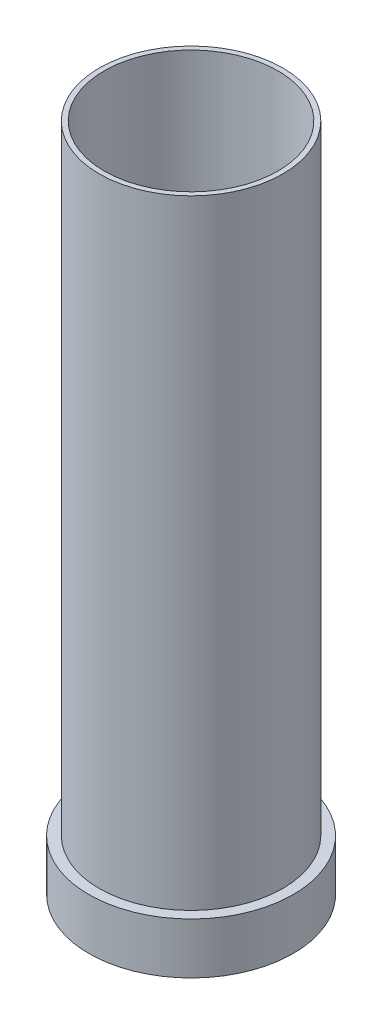
ISO-10303-21;
HEADER;
FILE_DESCRIPTION(('STEP AP214'),'2;1');
FILE_NAME('part.step','',(''),(''),'','','');
FILE_SCHEMA(('AUTOMOTIVE_DESIGN { 1 0 10303 214 1 1 1 1 }'));
ENDSEC;
DATA;
#1=APPLICATION_CONTEXT('core data for automotive mechanical design processes');
#2=APPLICATION_PROTOCOL_DEFINITION('international standard','automotive_design',2000,#1);
#3=PRODUCT_CONTEXT('',#1,'mechanical');
#4=PRODUCT('Part','Part','',(#3));
#5=PRODUCT_RELATED_PRODUCT_CATEGORY('part','',(#4));
#6=PRODUCT_DEFINITION_FORMATION('','',#4);
#7=PRODUCT_DEFINITION_CONTEXT('part definition',#1,'design');
#8=PRODUCT_DEFINITION('design','',#6,#7);
#9=PRODUCT_DEFINITION_SHAPE('','',#8);
#10=(LENGTH_UNIT() NAMED_UNIT(*) SI_UNIT(.MILLI.,.METRE.));
#11=(NAMED_UNIT(*) PLANE_ANGLE_UNIT() SI_UNIT($,.RADIAN.));
#12=(NAMED_UNIT(*) SI_UNIT($,.STERADIAN.) SOLID_ANGLE_UNIT());
#13=UNCERTAINTY_MEASURE_WITH_UNIT(LENGTH_MEASURE(1.E-05),#10,'distance_accuracy_value','');
#14=(GEOMETRIC_REPRESENTATION_CONTEXT(3) GLOBAL_UNCERTAINTY_ASSIGNED_CONTEXT((#13)) GLOBAL_UNIT_ASSIGNED_CONTEXT((#10,
#11,#12)) REPRESENTATION_CONTEXT('',''));
#15=CARTESIAN_POINT('',(0.,0.,0.));
#16=DIRECTION('',(0.,0.,1.));
#17=DIRECTION('',(1.,0.,0.));
#18=AXIS2_PLACEMENT_3D('',#15,#16,#17);
#19=CARTESIAN_POINT('',(0.,-77.2,0.));
#20=DIRECTION('',(0.,1.,0.));
#21=DIRECTION('',(0.,0.,1.));
#22=AXIS2_PLACEMENT_3D('',#19,#20,#21);
#23=CYLINDRICAL_SURFACE('',#22,22.45);
#24=CARTESIAN_POINT('',(0.,-77.2,0.));
#25=DIRECTION('',(0.,-1.,0.));
#26=DIRECTION('',(0.,0.,-1.));
#27=AXIS2_PLACEMENT_3D('',#24,#25,#26);
#28=CIRCLE('',#27,22.45);
#29=CARTESIAN_POINT('',(0.,-77.2,-22.45));
#30=VERTEX_POINT('',#29);
#31=EDGE_CURVE('E10',#30,#30,#28,.T.);
#32=ORIENTED_EDGE('',*,*,#31,.F.);
#33=EDGE_LOOP('',(#32));
#34=FACE_BOUND('',#33,.T.);
#35=CARTESIAN_POINT('',(0.,74.2,0.));
#36=DIRECTION('',(0.,1.,0.));
#37=DIRECTION('',(0.,0.,1.));
#38=AXIS2_PLACEMENT_3D('',#35,#36,#37);
#39=CIRCLE('',#38,22.45);
#40=CARTESIAN_POINT('',(0.,74.2,22.45));
#41=VERTEX_POINT('',#40);
#42=EDGE_CURVE('E40',#41,#41,#39,.F.);
#43=ORIENTED_EDGE('',*,*,#42,.T.);
#44=EDGE_LOOP('',(#43));
#45=FACE_BOUND('',#44,.T.);
#46=ADVANCED_FACE('F30',(#34,#45),#23,.T.);
#47=CARTESIAN_POINT('',(0.,-77.2,0.));
#48=DIRECTION('',(0.,1.,0.));
#49=DIRECTION('',(0.,0.,1.));
#50=AXIS2_PLACEMENT_3D('',#47,#48,#49);
#51=CYLINDRICAL_SURFACE('',#50,21.25);
#52=CARTESIAN_POINT('',(0.,-77.2,0.));
#53=DIRECTION('',(0.,-1.,0.));
#54=DIRECTION('',(0.,0.,-1.));
#55=AXIS2_PLACEMENT_3D('',#52,#53,#54);
#56=CIRCLE('',#55,21.25);
#57=CARTESIAN_POINT('',(0.,-77.2,-21.25));
#58=VERTEX_POINT('',#57);
#59=EDGE_CURVE('E45',#58,#58,#56,.T.);
#60=ORIENTED_EDGE('',*,*,#59,.T.);
#61=EDGE_LOOP('',(#60));
#62=FACE_BOUND('',#61,.T.);
#63=CARTESIAN_POINT('',(0.,74.2,0.));
#64=DIRECTION('',(0.,1.,0.));
#65=DIRECTION('',(0.,0.,1.));
#66=AXIS2_PLACEMENT_3D('',#63,#64,#65);
#67=CIRCLE('',#66,21.25);
#68=CARTESIAN_POINT('',(0.,74.2,21.25));
#69=VERTEX_POINT('',#68);
#70=EDGE_CURVE('E36',#69,#69,#67,.F.);
#71=ORIENTED_EDGE('',*,*,#70,.F.);
#72=EDGE_LOOP('',(#71));
#73=FACE_BOUND('',#72,.T.);
#74=ADVANCED_FACE('F76',(#62,#73),#51,.F.);
#75=CARTESIAN_POINT('',(0.,74.2,0.));
#76=DIRECTION('',(0.,1.,0.));
#77=DIRECTION('',(0.,0.,1.));
#78=AXIS2_PLACEMENT_3D('',#75,#76,#77);
#79=PLANE('',#78);
#80=ORIENTED_EDGE('',*,*,#42,.F.);
#81=EDGE_LOOP('',(#80));
#82=FACE_BOUND('',#81,.T.);
#83=ORIENTED_EDGE('',*,*,#70,.T.);
#84=EDGE_LOOP('',(#83));
#85=FACE_BOUND('',#84,.T.);
#86=ADVANCED_FACE('F73',(#82,#85),#79,.T.);
#87=CARTESIAN_POINT('',(0.,-77.2,0.));
#88=DIRECTION('',(0.,-1.,0.));
#89=DIRECTION('',(0.,0.,-1.));
#90=AXIS2_PLACEMENT_3D('',#87,#88,#89);
#91=PLANE('',#90);
#92=ORIENTED_EDGE('',*,*,#59,.F.);
#93=EDGE_LOOP('',(#92));
#94=FACE_BOUND('',#93,.T.);
#95=ADVANCED_FACE('F66',(#94),#91,.F.);
#96=CARTESIAN_POINT('',(0.,-89.7,0.));
#97=DIRECTION('',(0.,1.,0.));
#98=DIRECTION('',(0.,0.,1.));
#99=AXIS2_PLACEMENT_3D('',#96,#97,#98);
#100=CYLINDRICAL_SURFACE('',#99,25.);
#101=CARTESIAN_POINT('',(0.,-89.7,0.));
#102=DIRECTION('',(0.,-1.,0.));
#103=DIRECTION('',(0.,0.,-1.));
#104=AXIS2_PLACEMENT_3D('',#101,#102,#103);
#105=CIRCLE('',#104,25.);
#106=CARTESIAN_POINT('',(0.,-89.7,-25.));
#107=VERTEX_POINT('',#106);
#108=EDGE_CURVE('E51',#107,#107,#105,.T.);
#109=ORIENTED_EDGE('',*,*,#108,.F.);
#110=EDGE_LOOP('',(#109));
#111=FACE_BOUND('',#110,.T.);
#112=CARTESIAN_POINT('',(0.,-77.2,0.));
#113=DIRECTION('',(0.,-1.,0.));
#114=DIRECTION('',(0.,0.,-1.));
#115=AXIS2_PLACEMENT_3D('',#112,#113,#114);
#116=CIRCLE('',#115,25.);
#117=CARTESIAN_POINT('',(0.,-77.2,-25.));
#118=VERTEX_POINT('',#117);
#119=EDGE_CURVE('E48',#118,#118,#116,.T.);
#120=ORIENTED_EDGE('',*,*,#119,.T.);
#121=EDGE_LOOP('',(#120));
#122=FACE_BOUND('',#121,.T.);
#123=ADVANCED_FACE('F60',(#111,#122),#100,.T.);
#124=CARTESIAN_POINT('',(0.,-89.7,0.));
#125=DIRECTION('',(0.,-1.,0.));
#126=DIRECTION('',(0.,0.,-1.));
#127=AXIS2_PLACEMENT_3D('',#124,#125,#126);
#128=PLANE('',#127);
#129=ORIENTED_EDGE('',*,*,#108,.T.);
#130=EDGE_LOOP('',(#129));
#131=FACE_BOUND('',#130,.T.);
#132=ADVANCED_FACE('F64',(#131),#128,.T.);
#133=ORIENTED_EDGE('',*,*,#31,.T.);
#134=EDGE_LOOP('',(#133));
#135=FACE_BOUND('',#134,.T.);
#136=ORIENTED_EDGE('',*,*,#119,.F.);
#137=EDGE_LOOP('',(#136));
#138=FACE_BOUND('',#137,.T.);
#139=ADVANCED_FACE('F62',(#135,#138),#91,.F.);
#140=CLOSED_SHELL('',(#46,#74,#86,#95,#123,#132,#139));
#141=MANIFOLD_SOLID_BREP('B2',#140);
#142=ADVANCED_BREP_SHAPE_REPRESENTATION('',(#18,#141),#14);
#143=SHAPE_DEFINITION_REPRESENTATION(#9,#142);
ENDSEC;
END-ISO-10303-21;
